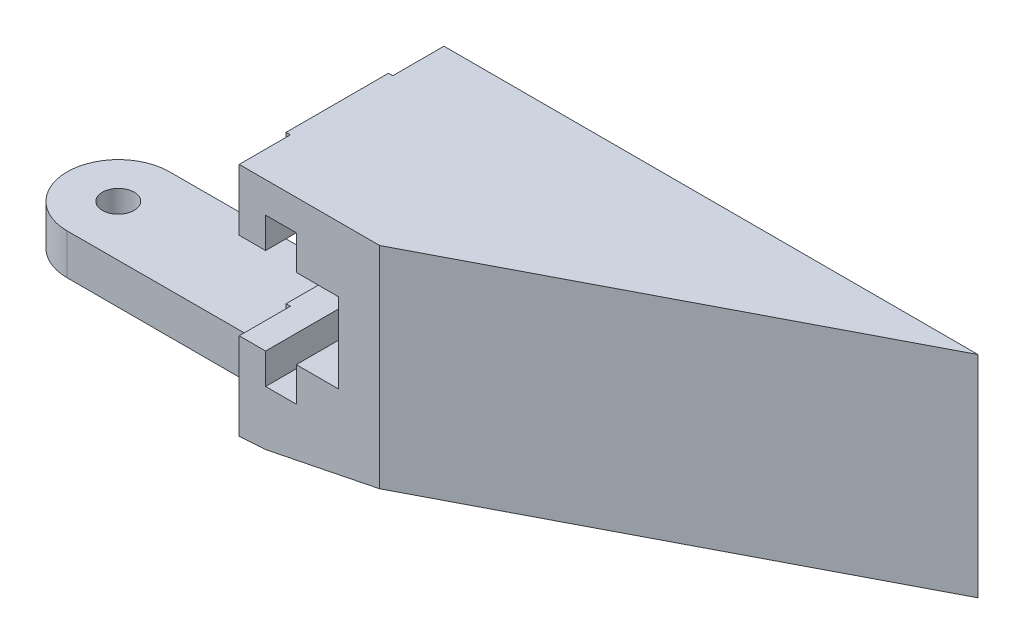
ISO-10303-21;
HEADER;
FILE_DESCRIPTION(('STEP AP214'),'2;1');
FILE_NAME('part.step','',(''),(''),'','','');
FILE_SCHEMA(('AUTOMOTIVE_DESIGN { 1 0 10303 214 1 1 1 1 }'));
ENDSEC;
DATA;
#1=APPLICATION_CONTEXT('core data for automotive mechanical design processes');
#2=APPLICATION_PROTOCOL_DEFINITION('international standard','automotive_design',2000,#1);
#3=PRODUCT_CONTEXT('',#1,'mechanical');
#4=PRODUCT('Part','Part','',(#3));
#5=PRODUCT_RELATED_PRODUCT_CATEGORY('part','',(#4));
#6=PRODUCT_DEFINITION_FORMATION('','',#4);
#7=PRODUCT_DEFINITION_CONTEXT('part definition',#1,'design');
#8=PRODUCT_DEFINITION('design','',#6,#7);
#9=PRODUCT_DEFINITION_SHAPE('','',#8);
#10=(LENGTH_UNIT() NAMED_UNIT(*) SI_UNIT(.MILLI.,.METRE.));
#11=(NAMED_UNIT(*) PLANE_ANGLE_UNIT() SI_UNIT($,.RADIAN.));
#12=(NAMED_UNIT(*) SI_UNIT($,.STERADIAN.) SOLID_ANGLE_UNIT());
#13=UNCERTAINTY_MEASURE_WITH_UNIT(LENGTH_MEASURE(1.E-05),#10,'distance_accuracy_value','');
#14=(GEOMETRIC_REPRESENTATION_CONTEXT(3) GLOBAL_UNCERTAINTY_ASSIGNED_CONTEXT((#13)) GLOBAL_UNIT_ASSIGNED_CONTEXT((#10,
#11,#12)) REPRESENTATION_CONTEXT('',''));
#15=CARTESIAN_POINT('',(0.,0.,0.));
#16=DIRECTION('',(0.,0.,1.));
#17=DIRECTION('',(1.,0.,0.));
#18=AXIS2_PLACEMENT_3D('',#15,#16,#17);
#19=CARTESIAN_POINT('',(-39.49001324769,-7.53608306718795,20.));
#20=DIRECTION('',(0.00136731456757834,-0.999999065225,0.));
#21=DIRECTION('',(0.999999065225,0.00136731456757834,0.));
#22=AXIS2_PLACEMENT_3D('',#19,#20,#21);
#23=PLANE('',#22);
#24=CARTESIAN_POINT('',(-34.49001324769,-7.5292464879594,9.99999999999999));
#25=DIRECTION('',(0.00136731456757834,-0.999999065225,0.));
#26=DIRECTION('',(-0.999999065225,-0.00136731456757834,0.));
#27=AXIS2_PLACEMENT_3D('',#24,#25,#26);
#28=ELLIPSE('',#27,1.55000144890261,1.55);
#29=CARTESIAN_POINT('',(-36.04001324769,-7.53136582752025,9.99999999999999));
#30=VERTEX_POINT('',#29);
#31=EDGE_CURVE('E234',#30,#30,#28,.T.);
#32=ORIENTED_EDGE('',*,*,#31,.T.);
#33=EDGE_LOOP('',(#32));
#34=FACE_BOUND('',#33,.T.);
#35=DIRECTION('',(-0.999999065225,-0.00136731456757834,0.));
#36=VECTOR('',#35,1.);
#37=CARTESIAN_POINT('',(-39.49001324769,-7.53608306718795,5.));
#38=LINE('',#37,#36);
#39=CARTESIAN_POINT('',(-13.1003043144092,-7.49999999999978,5.));
#40=VERTEX_POINT('',#39);
#41=CARTESIAN_POINT('',(-34.49001324769,-7.52924648795939,5.));
#42=VERTEX_POINT('',#41);
#43=EDGE_CURVE('E244',#40,#42,#38,.T.);
#44=ORIENTED_EDGE('',*,*,#43,.T.);
#45=CARTESIAN_POINT('',(-34.49001324769,-7.5292464879594,9.99999999999999));
#46=DIRECTION('',(0.00136731456757834,-0.999999065225,0.));
#47=DIRECTION('',(-0.999999065225,-0.00136731456757834,0.));
#48=AXIS2_PLACEMENT_3D('',#45,#46,#47);
#49=ELLIPSE('',#48,5.00000467387938,5.00000000000001);
#50=CARTESIAN_POINT('',(-34.49001324769,-7.52924648795939,15.));
#51=VERTEX_POINT('',#50);
#52=EDGE_CURVE('E224',#42,#51,#49,.F.);
#53=ORIENTED_EDGE('',*,*,#52,.T.);
#54=DIRECTION('',(0.999999065225,0.00136731456757834,0.));
#55=VECTOR('',#54,1.);
#56=CARTESIAN_POINT('',(-39.49001324769,-7.53608306718795,15.));
#57=LINE('',#56,#55);
#58=CARTESIAN_POINT('',(-13.1003043144092,-7.49999999999978,15.));
#59=VERTEX_POINT('',#58);
#60=EDGE_CURVE('E273',#51,#59,#57,.T.);
#61=ORIENTED_EDGE('',*,*,#60,.T.);
#62=DIRECTION('',(0.,0.,-1.));
#63=VECTOR('',#62,1.);
#64=CARTESIAN_POINT('',(-13.1003043144092,-7.49999999999978,20.));
#65=LINE('',#64,#63);
#66=EDGE_CURVE('E426',#59,#40,#65,.T.);
#67=ORIENTED_EDGE('',*,*,#66,.T.);
#68=EDGE_LOOP('',(#44,#53,#61,#67));
#69=FACE_BOUND('',#68,.T.);
#70=ADVANCED_FACE('F39',(#34,#69),#23,.F.);
#71=CARTESIAN_POINT('',(-12.6786659876891,-11.5000000000002,20.));
#72=DIRECTION('',(0.,1.,0.));
#73=DIRECTION('',(0.,0.,1.));
#74=AXIS2_PLACEMENT_3D('',#71,#72,#73);
#75=PLANE('',#74);
#76=CARTESIAN_POINT('',(-34.49001324769,-11.5000000000002,9.99999999999999));
#77=DIRECTION('',(0.,1.,0.));
#78=DIRECTION('',(0.,0.,1.));
#79=AXIS2_PLACEMENT_3D('',#76,#77,#78);
#80=CIRCLE('',#79,1.55);
#81=CARTESIAN_POINT('',(-34.49001324769,-11.5000000000002,11.55));
#82=VERTEX_POINT('',#81);
#83=EDGE_CURVE('E43',#82,#82,#80,.T.);
#84=ORIENTED_EDGE('',*,*,#83,.T.);
#85=EDGE_LOOP('',(#84));
#86=FACE_BOUND('',#85,.T.);
#87=CARTESIAN_POINT('',(-34.49001324769,-11.5000000000002,9.99999999999999));
#88=DIRECTION('',(0.,-1.,0.));
#89=DIRECTION('',(0.,0.,-1.));
#90=AXIS2_PLACEMENT_3D('',#87,#88,#89);
#91=CIRCLE('',#90,5.00000000000001);
#92=CARTESIAN_POINT('',(-34.49001324769,-11.5000000000002,5.));
#93=VERTEX_POINT('',#92);
#94=CARTESIAN_POINT('',(-34.49001324769,-11.5000000000002,15.));
#95=VERTEX_POINT('',#94);
#96=EDGE_CURVE('E58',#93,#95,#91,.F.);
#97=ORIENTED_EDGE('',*,*,#96,.F.);
#98=DIRECTION('',(1.,0.,0.));
#99=VECTOR('',#98,1.);
#100=CARTESIAN_POINT('',(-12.6786659876891,-11.5000000000002,5.));
#101=LINE('',#100,#99);
#102=CARTESIAN_POINT('',(-12.6786659876891,-11.5000000000002,5.));
#103=VERTEX_POINT('',#102);
#104=EDGE_CURVE('E230',#93,#103,#101,.T.);
#105=ORIENTED_EDGE('',*,*,#104,.T.);
#106=DIRECTION('',(0.,0.,-1.));
#107=VECTOR('',#106,1.);
#108=CARTESIAN_POINT('',(-12.6786659876891,-11.5000000000002,20.));
#109=LINE('',#108,#107);
#110=CARTESIAN_POINT('',(-12.6786659876891,-11.5000000000002,15.));
#111=VERTEX_POINT('',#110);
#112=EDGE_CURVE('E421',#111,#103,#109,.T.);
#113=ORIENTED_EDGE('',*,*,#112,.F.);
#114=DIRECTION('',(-1.,0.,0.));
#115=VECTOR('',#114,1.);
#116=CARTESIAN_POINT('',(-12.6786659876891,-11.5000000000002,15.));
#117=LINE('',#116,#115);
#118=EDGE_CURVE('E232',#111,#95,#117,.T.);
#119=ORIENTED_EDGE('',*,*,#118,.T.);
#120=EDGE_LOOP('',(#97,#105,#113,#119));
#121=FACE_BOUND('',#120,.T.);
#122=ADVANCED_FACE('F227',(#86,#121),#75,.F.);
#123=CARTESIAN_POINT('',(-12.6786659876891,11.5000000000002,15.));
#124=DIRECTION('',(0.,0.,-1.));
#125=DIRECTION('',(-1.,0.,0.));
#126=AXIS2_PLACEMENT_3D('',#123,#124,#125);
#127=PLANE('',#126);
#128=DIRECTION('',(0.,-1.,0.));
#129=VECTOR('',#128,1.);
#130=CARTESIAN_POINT('',(-34.49001324769,11.5000000000002,15.));
#131=LINE('',#130,#129);
#132=EDGE_CURVE('E50',#95,#51,#131,.F.);
#133=ORIENTED_EDGE('',*,*,#132,.F.);
#134=ORIENTED_EDGE('',*,*,#118,.F.);
#135=DIRECTION('',(0.,-1.,0.));
#136=VECTOR('',#135,1.);
#137=CARTESIAN_POINT('',(-12.6786659876891,11.5000000000002,15.));
#138=LINE('',#137,#136);
#139=CARTESIAN_POINT('',(-12.6786659876891,-2.99999999999976,15.));
#140=VERTEX_POINT('',#139);
#141=EDGE_CURVE('E545',#140,#111,#138,.T.);
#142=ORIENTED_EDGE('',*,*,#141,.F.);
#143=DIRECTION('',(1.,0.,0.));
#144=VECTOR('',#143,1.);
#145=CARTESIAN_POINT('',(-13.1003043144092,-2.99999999999977,15.));
#146=LINE('',#145,#144);
#147=CARTESIAN_POINT('',(-13.1003043144092,-2.99999999999977,15.));
#148=VERTEX_POINT('',#147);
#149=EDGE_CURVE('E280',#148,#140,#146,.T.);
#150=ORIENTED_EDGE('',*,*,#149,.F.);
#151=DIRECTION('',(0.,1.,0.));
#152=VECTOR('',#151,1.);
#153=CARTESIAN_POINT('',(-13.1003043144092,-7.49999999999978,15.));
#154=LINE('',#153,#152);
#155=EDGE_CURVE('E276',#59,#148,#154,.T.);
#156=ORIENTED_EDGE('',*,*,#155,.F.);
#157=ORIENTED_EDGE('',*,*,#60,.F.);
#158=EDGE_LOOP('',(#133,#134,#142,#150,#156,#157));
#159=FACE_BOUND('',#158,.T.);
#160=ADVANCED_FACE('F493',(#159),#127,.F.);
#161=CARTESIAN_POINT('',(-13.1003043144223,5.50000000000023,20.));
#162=DIRECTION('',(1.,0.,0.));
#163=DIRECTION('',(0.,0.,-1.));
#164=AXIS2_PLACEMENT_3D('',#161,#162,#163);
#165=PLANE('',#164);
#166=DIRECTION('',(0.,0.,-1.));
#167=VECTOR('',#166,1.);
#168=CARTESIAN_POINT('',(-13.1003043144223,5.50000000000023,20.));
#169=LINE('',#168,#167);
#170=CARTESIAN_POINT('',(-13.1003043144223,5.50000000000023,15.));
#171=VERTEX_POINT('',#170);
#172=CARTESIAN_POINT('',(-13.1003043144223,5.50000000000023,5.));
#173=VERTEX_POINT('',#172);
#174=EDGE_CURVE('E474',#171,#173,#169,.T.);
#175=ORIENTED_EDGE('',*,*,#174,.F.);
#176=DIRECTION('',(0.,1.,0.));
#177=VECTOR('',#176,1.);
#178=CARTESIAN_POINT('',(-13.1003043144223,5.50000000000023,15.));
#179=LINE('',#178,#177);
#180=CARTESIAN_POINT('',(-13.1003043144223,11.5000000000002,15.));
#181=VERTEX_POINT('',#180);
#182=EDGE_CURVE('E288',#171,#181,#179,.T.);
#183=ORIENTED_EDGE('',*,*,#182,.T.);
#184=DIRECTION('',(0.,0.,-1.));
#185=VECTOR('',#184,1.);
#186=CARTESIAN_POINT('',(-13.1003043144223,11.5000000000002,20.));
#187=LINE('',#186,#185);
#188=CARTESIAN_POINT('',(-13.1003043144223,11.5000000000002,5.));
#189=VERTEX_POINT('',#188);
#190=EDGE_CURVE('E353',#181,#189,#187,.T.);
#191=ORIENTED_EDGE('',*,*,#190,.T.);
#192=DIRECTION('',(0.,-1.,0.));
#193=VECTOR('',#192,1.);
#194=CARTESIAN_POINT('',(-13.1003043144223,5.50000000000023,5.));
#195=LINE('',#194,#193);
#196=EDGE_CURVE('E267',#189,#173,#195,.T.);
#197=ORIENTED_EDGE('',*,*,#196,.T.);
#198=EDGE_LOOP('',(#175,#183,#191,#197));
#199=FACE_BOUND('',#198,.T.);
#200=ADVANCED_FACE('F41',(#199),#165,.F.);
#201=CARTESIAN_POINT('',(-10.1003043144092,5.50000000000023,20.));
#202=DIRECTION('',(0.,1.,0.));
#203=DIRECTION('',(0.,0.,1.));
#204=AXIS2_PLACEMENT_3D('',#201,#202,#203);
#205=PLANE('',#204);
#206=DIRECTION('',(1.,0.,0.));
#207=VECTOR('',#206,1.);
#208=CARTESIAN_POINT('',(-10.1003043144092,5.50000000000023,20.));
#209=LINE('',#208,#207);
#210=CARTESIAN_POINT('',(-12.6786659876891,5.50000000000023,20.));
#211=VERTEX_POINT('',#210);
#212=CARTESIAN_POINT('',(-10.1003043144092,5.50000000000023,20.));
#213=VERTEX_POINT('',#212);
#214=EDGE_CURVE('E304',#211,#213,#209,.T.);
#215=ORIENTED_EDGE('',*,*,#214,.F.);
#216=DIRECTION('',(0.,0.,-1.));
#217=VECTOR('',#216,1.);
#218=CARTESIAN_POINT('',(-12.6786659876891,5.50000000000023,20.));
#219=LINE('',#218,#217);
#220=CARTESIAN_POINT('',(-12.6786659876891,5.50000000000023,15.));
#221=VERTEX_POINT('',#220);
#222=EDGE_CURVE('E245',#211,#221,#219,.T.);
#223=ORIENTED_EDGE('',*,*,#222,.T.);
#224=DIRECTION('',(-1.,0.,0.));
#225=VECTOR('',#224,1.);
#226=CARTESIAN_POINT('',(-10.1003043144092,5.50000000000023,15.));
#227=LINE('',#226,#225);
#228=EDGE_CURVE('E284',#221,#171,#227,.T.);
#229=ORIENTED_EDGE('',*,*,#228,.T.);
#230=ORIENTED_EDGE('',*,*,#174,.T.);
#231=DIRECTION('',(1.,0.,0.));
#232=VECTOR('',#231,1.);
#233=CARTESIAN_POINT('',(-10.1003043144092,5.50000000000023,5.));
#234=LINE('',#233,#232);
#235=CARTESIAN_POINT('',(-12.6786659876891,5.50000000000023,5.));
#236=VERTEX_POINT('',#235);
#237=EDGE_CURVE('E263',#173,#236,#234,.T.);
#238=ORIENTED_EDGE('',*,*,#237,.T.);
#239=DIRECTION('',(0.,0.,-1.));
#240=VECTOR('',#239,1.);
#241=CARTESIAN_POINT('',(-12.6786659876891,5.50000000000023,20.));
#242=LINE('',#241,#240);
#243=CARTESIAN_POINT('',(-12.6786659876891,5.50000000000023,0.));
#244=VERTEX_POINT('',#243);
#245=EDGE_CURVE('E507',#236,#244,#242,.T.);
#246=ORIENTED_EDGE('',*,*,#245,.T.);
#247=DIRECTION('',(1.,0.,0.));
#248=VECTOR('',#247,1.);
#249=CARTESIAN_POINT('',(-10.1003043144092,5.50000000000023,0.));
#250=LINE('',#249,#248);
#251=CARTESIAN_POINT('',(-10.1003043144092,5.50000000000023,0.));
#252=VERTEX_POINT('',#251);
#253=EDGE_CURVE('E303',#244,#252,#250,.T.);
#254=ORIENTED_EDGE('',*,*,#253,.T.);
#255=DIRECTION('',(0.,0.,-1.));
#256=VECTOR('',#255,1.);
#257=CARTESIAN_POINT('',(-10.1003043144092,5.50000000000023,20.));
#258=LINE('',#257,#256);
#259=EDGE_CURVE('E470',#213,#252,#258,.T.);
#260=ORIENTED_EDGE('',*,*,#259,.F.);
#261=EDGE_LOOP('',(#215,#223,#229,#230,#238,#246,#254,#260));
#262=FACE_BOUND('',#261,.T.);
#263=ADVANCED_FACE('F631',(#262),#205,.F.);
#264=CARTESIAN_POINT('',(-10.1003043144092,8.50000000000023,20.));
#265=DIRECTION('',(-1.,0.,0.));
#266=DIRECTION('',(0.,0.,1.));
#267=AXIS2_PLACEMENT_3D('',#264,#265,#266);
#268=PLANE('',#267);
#269=DIRECTION('',(0.,1.,0.));
#270=VECTOR('',#269,1.);
#271=CARTESIAN_POINT('',(-10.1003043144092,8.50000000000023,0.));
#272=LINE('',#271,#270);
#273=CARTESIAN_POINT('',(-10.1003043144092,8.50000000000023,0.));
#274=VERTEX_POINT('',#273);
#275=EDGE_CURVE('E356',#252,#274,#272,.T.);
#276=ORIENTED_EDGE('',*,*,#275,.T.);
#277=DIRECTION('',(0.,0.,-1.));
#278=VECTOR('',#277,1.);
#279=CARTESIAN_POINT('',(-10.1003043144092,8.50000000000023,20.));
#280=LINE('',#279,#278);
#281=CARTESIAN_POINT('',(-10.1003043144092,8.50000000000023,20.));
#282=VERTEX_POINT('',#281);
#283=EDGE_CURVE('E466',#282,#274,#280,.T.);
#284=ORIENTED_EDGE('',*,*,#283,.F.);
#285=DIRECTION('',(0.,1.,0.));
#286=VECTOR('',#285,1.);
#287=CARTESIAN_POINT('',(-10.1003043144092,8.50000000000023,20.));
#288=LINE('',#287,#286);
#289=EDGE_CURVE('E307',#213,#282,#288,.T.);
#290=ORIENTED_EDGE('',*,*,#289,.F.);
#291=ORIENTED_EDGE('',*,*,#259,.T.);
#292=EDGE_LOOP('',(#276,#284,#290,#291));
#293=FACE_BOUND('',#292,.T.);
#294=ADVANCED_FACE('F628',(#293),#268,.F.);
#295=CARTESIAN_POINT('',(-7.10030431440922,8.50000000000023,20.));
#296=DIRECTION('',(0.,1.,0.));
#297=DIRECTION('',(0.,0.,1.));
#298=AXIS2_PLACEMENT_3D('',#295,#296,#297);
#299=PLANE('',#298);
#300=DIRECTION('',(1.,0.,0.));
#301=VECTOR('',#300,1.);
#302=CARTESIAN_POINT('',(-7.10030431440922,8.50000000000023,0.));
#303=LINE('',#302,#301);
#304=CARTESIAN_POINT('',(-7.10030431440922,8.50000000000023,0.));
#305=VERTEX_POINT('',#304);
#306=EDGE_CURVE('E359',#274,#305,#303,.T.);
#307=ORIENTED_EDGE('',*,*,#306,.T.);
#308=DIRECTION('',(0.,0.,-1.));
#309=VECTOR('',#308,1.);
#310=CARTESIAN_POINT('',(-7.10030431440922,8.50000000000023,20.));
#311=LINE('',#310,#309);
#312=CARTESIAN_POINT('',(-7.10030431440922,8.50000000000023,20.));
#313=VERTEX_POINT('',#312);
#314=EDGE_CURVE('E462',#313,#305,#311,.T.);
#315=ORIENTED_EDGE('',*,*,#314,.F.);
#316=DIRECTION('',(1.,0.,0.));
#317=VECTOR('',#316,1.);
#318=CARTESIAN_POINT('',(-7.10030431440922,8.50000000000023,20.));
#319=LINE('',#318,#317);
#320=EDGE_CURVE('E311',#282,#313,#319,.T.);
#321=ORIENTED_EDGE('',*,*,#320,.F.);
#322=ORIENTED_EDGE('',*,*,#283,.T.);
#323=EDGE_LOOP('',(#307,#315,#321,#322));
#324=FACE_BOUND('',#323,.T.);
#325=ADVANCED_FACE('F624',(#324),#299,.F.);
#326=CARTESIAN_POINT('',(-7.10030431440922,5.15000000000023,20.));
#327=DIRECTION('',(1.,0.,0.));
#328=DIRECTION('',(0.,0.,-1.));
#329=AXIS2_PLACEMENT_3D('',#326,#327,#328);
#330=PLANE('',#329);
#331=DIRECTION('',(0.,-1.,0.));
#332=VECTOR('',#331,1.);
#333=CARTESIAN_POINT('',(-7.10030431440922,5.15000000000023,0.));
#334=LINE('',#333,#332);
#335=CARTESIAN_POINT('',(-7.10030431440922,5.15000000000023,0.));
#336=VERTEX_POINT('',#335);
#337=EDGE_CURVE('E362',#305,#336,#334,.T.);
#338=ORIENTED_EDGE('',*,*,#337,.T.);
#339=DIRECTION('',(0.,0.,-1.));
#340=VECTOR('',#339,1.);
#341=CARTESIAN_POINT('',(-7.10030431440922,5.15000000000023,20.));
#342=LINE('',#341,#340);
#343=CARTESIAN_POINT('',(-7.10030431440922,5.15000000000023,20.));
#344=VERTEX_POINT('',#343);
#345=EDGE_CURVE('E458',#344,#336,#342,.T.);
#346=ORIENTED_EDGE('',*,*,#345,.F.);
#347=DIRECTION('',(0.,-1.,0.));
#348=VECTOR('',#347,1.);
#349=CARTESIAN_POINT('',(-7.10030431440922,5.15000000000023,20.));
#350=LINE('',#349,#348);
#351=EDGE_CURVE('E314',#313,#344,#350,.T.);
#352=ORIENTED_EDGE('',*,*,#351,.F.);
#353=ORIENTED_EDGE('',*,*,#314,.T.);
#354=EDGE_LOOP('',(#338,#346,#352,#353));
#355=FACE_BOUND('',#354,.T.);
#356=ADVANCED_FACE('F620',(#355),#330,.F.);
#357=CARTESIAN_POINT('',(-3.00030431440922,5.15000000000023,20.));
#358=DIRECTION('',(0.,1.,0.));
#359=DIRECTION('',(0.,0.,1.));
#360=AXIS2_PLACEMENT_3D('',#357,#358,#359);
#361=PLANE('',#360);
#362=DIRECTION('',(1.,0.,0.));
#363=VECTOR('',#362,1.);
#364=CARTESIAN_POINT('',(-3.00030431440922,5.15000000000023,0.));
#365=LINE('',#364,#363);
#366=CARTESIAN_POINT('',(-3.00030431440922,5.15000000000023,0.));
#367=VERTEX_POINT('',#366);
#368=EDGE_CURVE('E365',#336,#367,#365,.T.);
#369=ORIENTED_EDGE('',*,*,#368,.T.);
#370=DIRECTION('',(0.,0.,-1.));
#371=VECTOR('',#370,1.);
#372=CARTESIAN_POINT('',(-3.00030431440922,5.15000000000023,20.));
#373=LINE('',#372,#371);
#374=CARTESIAN_POINT('',(-3.00030431440922,5.15000000000023,20.));
#375=VERTEX_POINT('',#374);
#376=EDGE_CURVE('E454',#375,#367,#373,.T.);
#377=ORIENTED_EDGE('',*,*,#376,.F.);
#378=DIRECTION('',(1.,0.,0.));
#379=VECTOR('',#378,1.);
#380=CARTESIAN_POINT('',(-3.00030431440922,5.15000000000023,20.));
#381=LINE('',#380,#379);
#382=EDGE_CURVE('E317',#344,#375,#381,.T.);
#383=ORIENTED_EDGE('',*,*,#382,.F.);
#384=ORIENTED_EDGE('',*,*,#345,.T.);
#385=EDGE_LOOP('',(#369,#377,#383,#384));
#386=FACE_BOUND('',#385,.T.);
#387=ADVANCED_FACE('F616',(#386),#361,.F.);
#388=CARTESIAN_POINT('',(-3.00030431440922,-2.64999999999977,20.));
#389=DIRECTION('',(1.,0.,0.));
#390=DIRECTION('',(0.,0.,-1.));
#391=AXIS2_PLACEMENT_3D('',#388,#389,#390);
#392=PLANE('',#391);
#393=DIRECTION('',(0.,-1.,0.));
#394=VECTOR('',#393,1.);
#395=CARTESIAN_POINT('',(-3.00030431440922,-2.64999999999977,0.));
#396=LINE('',#395,#394);
#397=CARTESIAN_POINT('',(-3.00030431440922,-2.64999999999977,0.));
#398=VERTEX_POINT('',#397);
#399=EDGE_CURVE('E368',#367,#398,#396,.T.);
#400=ORIENTED_EDGE('',*,*,#399,.T.);
#401=DIRECTION('',(0.,0.,-1.));
#402=VECTOR('',#401,1.);
#403=CARTESIAN_POINT('',(-3.00030431440922,-2.64999999999977,20.));
#404=LINE('',#403,#402);
#405=CARTESIAN_POINT('',(-3.00030431440922,-2.64999999999977,20.));
#406=VERTEX_POINT('',#405);
#407=EDGE_CURVE('E450',#406,#398,#404,.T.);
#408=ORIENTED_EDGE('',*,*,#407,.F.);
#409=DIRECTION('',(0.,-1.,0.));
#410=VECTOR('',#409,1.);
#411=CARTESIAN_POINT('',(-3.00030431440922,-2.64999999999977,20.));
#412=LINE('',#411,#410);
#413=EDGE_CURVE('E320',#375,#406,#412,.T.);
#414=ORIENTED_EDGE('',*,*,#413,.F.);
#415=ORIENTED_EDGE('',*,*,#376,.T.);
#416=EDGE_LOOP('',(#400,#408,#414,#415));
#417=FACE_BOUND('',#416,.T.);
#418=ADVANCED_FACE('F612',(#417),#392,.F.);
#419=CARTESIAN_POINT('',(-7.10030431440923,-2.64999999999977,20.));
#420=DIRECTION('',(0.,-1.,0.));
#421=DIRECTION('',(0.,0.,-1.));
#422=AXIS2_PLACEMENT_3D('',#419,#420,#421);
#423=PLANE('',#422);
#424=DIRECTION('',(-1.,0.,0.));
#425=VECTOR('',#424,1.);
#426=CARTESIAN_POINT('',(-7.10030431440923,-2.64999999999977,0.));
#427=LINE('',#426,#425);
#428=CARTESIAN_POINT('',(-7.10030431440923,-2.64999999999977,0.));
#429=VERTEX_POINT('',#428);
#430=EDGE_CURVE('E371',#398,#429,#427,.T.);
#431=ORIENTED_EDGE('',*,*,#430,.T.);
#432=DIRECTION('',(0.,0.,-1.));
#433=VECTOR('',#432,1.);
#434=CARTESIAN_POINT('',(-7.10030431440923,-2.64999999999977,20.));
#435=LINE('',#434,#433);
#436=CARTESIAN_POINT('',(-7.10030431440923,-2.64999999999977,20.));
#437=VERTEX_POINT('',#436);
#438=EDGE_CURVE('E446',#437,#429,#435,.T.);
#439=ORIENTED_EDGE('',*,*,#438,.F.);
#440=DIRECTION('',(-1.,0.,0.));
#441=VECTOR('',#440,1.);
#442=CARTESIAN_POINT('',(-7.10030431440923,-2.64999999999977,20.));
#443=LINE('',#442,#441);
#444=EDGE_CURVE('E323',#406,#437,#443,.T.);
#445=ORIENTED_EDGE('',*,*,#444,.F.);
#446=ORIENTED_EDGE('',*,*,#407,.T.);
#447=EDGE_LOOP('',(#431,#439,#445,#446));
#448=FACE_BOUND('',#447,.T.);
#449=ADVANCED_FACE('F608',(#448),#423,.F.);
#450=CARTESIAN_POINT('',(-7.10030431440923,-5.99999999999977,20.));
#451=DIRECTION('',(1.,0.,0.));
#452=DIRECTION('',(0.,0.,-1.));
#453=AXIS2_PLACEMENT_3D('',#450,#451,#452);
#454=PLANE('',#453);
#455=DIRECTION('',(0.,-1.,0.));
#456=VECTOR('',#455,1.);
#457=CARTESIAN_POINT('',(-7.10030431440923,-5.99999999999977,0.));
#458=LINE('',#457,#456);
#459=CARTESIAN_POINT('',(-7.10030431440923,-5.99999999999977,0.));
#460=VERTEX_POINT('',#459);
#461=EDGE_CURVE('E374',#429,#460,#458,.T.);
#462=ORIENTED_EDGE('',*,*,#461,.T.);
#463=DIRECTION('',(0.,0.,-1.));
#464=VECTOR('',#463,1.);
#465=CARTESIAN_POINT('',(-7.10030431440923,-5.99999999999977,20.));
#466=LINE('',#465,#464);
#467=CARTESIAN_POINT('',(-7.10030431440923,-5.99999999999977,20.));
#468=VERTEX_POINT('',#467);
#469=EDGE_CURVE('E442',#468,#460,#466,.T.);
#470=ORIENTED_EDGE('',*,*,#469,.F.);
#471=DIRECTION('',(0.,-1.,0.));
#472=VECTOR('',#471,1.);
#473=CARTESIAN_POINT('',(-7.10030431440923,-5.99999999999977,20.));
#474=LINE('',#473,#472);
#475=EDGE_CURVE('E326',#437,#468,#474,.T.);
#476=ORIENTED_EDGE('',*,*,#475,.F.);
#477=ORIENTED_EDGE('',*,*,#438,.T.);
#478=EDGE_LOOP('',(#462,#470,#476,#477));
#479=FACE_BOUND('',#478,.T.);
#480=ADVANCED_FACE('F604',(#479),#454,.F.);
#481=CARTESIAN_POINT('',(-10.1003043144092,-5.99999999999977,20.));
#482=DIRECTION('',(0.,-1.,0.));
#483=DIRECTION('',(0.,0.,-1.));
#484=AXIS2_PLACEMENT_3D('',#481,#482,#483);
#485=PLANE('',#484);
#486=DIRECTION('',(-1.,0.,0.));
#487=VECTOR('',#486,1.);
#488=CARTESIAN_POINT('',(-10.1003043144092,-5.99999999999977,0.));
#489=LINE('',#488,#487);
#490=CARTESIAN_POINT('',(-10.1003043144092,-5.99999999999977,0.));
#491=VERTEX_POINT('',#490);
#492=EDGE_CURVE('E377',#460,#491,#489,.T.);
#493=ORIENTED_EDGE('',*,*,#492,.T.);
#494=DIRECTION('',(0.,0.,-1.));
#495=VECTOR('',#494,1.);
#496=CARTESIAN_POINT('',(-10.1003043144092,-5.99999999999977,20.));
#497=LINE('',#496,#495);
#498=CARTESIAN_POINT('',(-10.1003043144092,-5.99999999999977,20.));
#499=VERTEX_POINT('',#498);
#500=EDGE_CURVE('E438',#499,#491,#497,.T.);
#501=ORIENTED_EDGE('',*,*,#500,.F.);
#502=DIRECTION('',(-1.,0.,0.));
#503=VECTOR('',#502,1.);
#504=CARTESIAN_POINT('',(-10.1003043144092,-5.99999999999977,20.));
#505=LINE('',#504,#503);
#506=EDGE_CURVE('E329',#468,#499,#505,.T.);
#507=ORIENTED_EDGE('',*,*,#506,.F.);
#508=ORIENTED_EDGE('',*,*,#469,.T.);
#509=EDGE_LOOP('',(#493,#501,#507,#508));
#510=FACE_BOUND('',#509,.T.);
#511=ADVANCED_FACE('F601',(#510),#485,.F.);
#512=CARTESIAN_POINT('',(-10.1003043144092,-2.99999999999977,20.));
#513=DIRECTION('',(-1.,0.,0.));
#514=DIRECTION('',(0.,0.,1.));
#515=AXIS2_PLACEMENT_3D('',#512,#513,#514);
#516=PLANE('',#515);
#517=DIRECTION('',(0.,1.,0.));
#518=VECTOR('',#517,1.);
#519=CARTESIAN_POINT('',(-10.1003043144092,-2.99999999999977,0.));
#520=LINE('',#519,#518);
#521=CARTESIAN_POINT('',(-10.1003043144092,-2.99999999999977,0.));
#522=VERTEX_POINT('',#521);
#523=EDGE_CURVE('E380',#491,#522,#520,.T.);
#524=ORIENTED_EDGE('',*,*,#523,.T.);
#525=DIRECTION('',(0.,0.,-1.));
#526=VECTOR('',#525,1.);
#527=CARTESIAN_POINT('',(-10.1003043144092,-2.99999999999977,20.));
#528=LINE('',#527,#526);
#529=CARTESIAN_POINT('',(-10.1003043144092,-2.99999999999977,20.));
#530=VERTEX_POINT('',#529);
#531=EDGE_CURVE('E434',#530,#522,#528,.T.);
#532=ORIENTED_EDGE('',*,*,#531,.F.);
#533=DIRECTION('',(0.,1.,0.));
#534=VECTOR('',#533,1.);
#535=CARTESIAN_POINT('',(-10.1003043144092,-2.99999999999977,20.));
#536=LINE('',#535,#534);
#537=EDGE_CURVE('E332',#499,#530,#536,.T.);
#538=ORIENTED_EDGE('',*,*,#537,.F.);
#539=ORIENTED_EDGE('',*,*,#500,.T.);
#540=EDGE_LOOP('',(#524,#532,#538,#539));
#541=FACE_BOUND('',#540,.T.);
#542=ADVANCED_FACE('F531',(#541),#516,.F.);
#543=CARTESIAN_POINT('',(-13.1003043144092,-2.99999999999977,20.));
#544=DIRECTION('',(0.,-1.,0.));
#545=DIRECTION('',(0.,0.,-1.));
#546=AXIS2_PLACEMENT_3D('',#543,#544,#545);
#547=PLANE('',#546);
#548=ORIENTED_EDGE('',*,*,#149,.T.);
#549=DIRECTION('',(0.,0.,1.));
#550=VECTOR('',#549,1.);
#551=CARTESIAN_POINT('',(-12.6786659876891,-2.99999999999977,20.));
#552=LINE('',#551,#550);
#553=CARTESIAN_POINT('',(-12.6786659876891,-2.99999999999976,20.));
#554=VERTEX_POINT('',#553);
#555=EDGE_CURVE('E252',#140,#554,#552,.T.);
#556=ORIENTED_EDGE('',*,*,#555,.T.);
#557=DIRECTION('',(-1.,0.,0.));
#558=VECTOR('',#557,1.);
#559=CARTESIAN_POINT('',(-13.1003043144092,-2.99999999999977,20.));
#560=LINE('',#559,#558);
#561=EDGE_CURVE('E335',#530,#554,#560,.T.);
#562=ORIENTED_EDGE('',*,*,#561,.F.);
#563=ORIENTED_EDGE('',*,*,#531,.T.);
#564=DIRECTION('',(-1.,0.,0.));
#565=VECTOR('',#564,1.);
#566=CARTESIAN_POINT('',(-13.1003043144092,-2.99999999999977,0.));
#567=LINE('',#566,#565);
#568=CARTESIAN_POINT('',(-12.6786659876891,-2.99999999999977,0.));
#569=VERTEX_POINT('',#568);
#570=EDGE_CURVE('E383',#522,#569,#567,.T.);
#571=ORIENTED_EDGE('',*,*,#570,.T.);
#572=DIRECTION('',(0.,0.,1.));
#573=VECTOR('',#572,1.);
#574=CARTESIAN_POINT('',(-12.6786659876891,-2.99999999999977,20.));
#575=LINE('',#574,#573);
#576=CARTESIAN_POINT('',(-12.6786659876891,-2.99999999999976,5.));
#577=VERTEX_POINT('',#576);
#578=EDGE_CURVE('E502',#569,#577,#575,.T.);
#579=ORIENTED_EDGE('',*,*,#578,.T.);
#580=DIRECTION('',(-1.,0.,0.));
#581=VECTOR('',#580,1.);
#582=CARTESIAN_POINT('',(-13.1003043144092,-2.99999999999977,5.));
#583=LINE('',#582,#581);
#584=CARTESIAN_POINT('',(-13.1003043144092,-2.99999999999977,5.));
#585=VERTEX_POINT('',#584);
#586=EDGE_CURVE('E259',#577,#585,#583,.T.);
#587=ORIENTED_EDGE('',*,*,#586,.T.);
#588=DIRECTION('',(0.,0.,-1.));
#589=VECTOR('',#588,1.);
#590=CARTESIAN_POINT('',(-13.1003043144092,-2.99999999999977,20.));
#591=LINE('',#590,#589);
#592=EDGE_CURVE('E430',#148,#585,#591,.T.);
#593=ORIENTED_EDGE('',*,*,#592,.F.);
#594=EDGE_LOOP('',(#548,#556,#562,#563,#571,#579,#587,#593));
#595=FACE_BOUND('',#594,.T.);
#596=ADVANCED_FACE('F501',(#595),#547,.F.);
#597=CARTESIAN_POINT('',(-13.1003043144092,-7.49999999999978,20.));
#598=DIRECTION('',(1.,0.,0.));
#599=DIRECTION('',(0.,0.,-1.));
#600=AXIS2_PLACEMENT_3D('',#597,#598,#599);
#601=PLANE('',#600);
#602=ORIENTED_EDGE('',*,*,#66,.F.);
#603=ORIENTED_EDGE('',*,*,#155,.T.);
#604=ORIENTED_EDGE('',*,*,#592,.T.);
#605=DIRECTION('',(0.,-1.,0.));
#606=VECTOR('',#605,1.);
#607=CARTESIAN_POINT('',(-13.1003043144092,-7.49999999999978,5.));
#608=LINE('',#607,#606);
#609=EDGE_CURVE('E249',#585,#40,#608,.T.);
#610=ORIENTED_EDGE('',*,*,#609,.T.);
#611=EDGE_LOOP('',(#602,#603,#604,#610));
#612=FACE_BOUND('',#611,.T.);
#613=ADVANCED_FACE('F498',(#612),#601,.F.);
#614=CARTESIAN_POINT('',(-10.0240029671808,-11.3230362015424,20.));
#615=DIRECTION('',(-0.066513870443531,0.997785500515327,0.));
#616=DIRECTION('',(-0.997785500515327,-0.066513870443531,0.));
#617=AXIS2_PLACEMENT_3D('',#614,#615,#616);
#618=PLANE('',#617);
#619=DIRECTION('',(0.997785500515327,0.066513870443531,0.));
#620=VECTOR('',#619,1.);
#621=CARTESIAN_POINT('',(-10.0240029671808,-11.3230362015424,0.));
#622=LINE('',#621,#620);
#623=CARTESIAN_POINT('',(-12.6786659876891,-11.5000000000002,0.));
#624=VERTEX_POINT('',#623);
#625=CARTESIAN_POINT('',(-10.0240029671808,-11.3230362015424,0.));
#626=VERTEX_POINT('',#625);
#627=EDGE_CURVE('E387',#624,#626,#622,.T.);
#628=ORIENTED_EDGE('',*,*,#627,.T.);
#629=DIRECTION('',(0.,0.,-1.));
#630=VECTOR('',#629,1.);
#631=CARTESIAN_POINT('',(-10.0240029671808,-11.3230362015424,20.));
#632=LINE('',#631,#630);
#633=CARTESIAN_POINT('',(-10.0240029671808,-11.3230362015424,20.));
#634=VERTEX_POINT('',#633);
#635=EDGE_CURVE('E417',#634,#626,#632,.T.);
#636=ORIENTED_EDGE('',*,*,#635,.F.);
#637=DIRECTION('',(0.997785500515327,0.066513870443531,0.));
#638=VECTOR('',#637,1.);
#639=CARTESIAN_POINT('',(-10.0240029671808,-11.3230362015424,20.));
#640=LINE('',#639,#638);
#641=CARTESIAN_POINT('',(-12.6786659876891,-11.5000000000002,20.));
#642=VERTEX_POINT('',#641);
#643=EDGE_CURVE('E339',#642,#634,#640,.T.);
#644=ORIENTED_EDGE('',*,*,#643,.F.);
#645=EDGE_CURVE('E422',#642,#111,#109,.T.);
#646=ORIENTED_EDGE('',*,*,#645,.T.);
#647=ORIENTED_EDGE('',*,*,#112,.T.);
#648=DIRECTION('',(0.,0.,-1.));
#649=VECTOR('',#648,1.);
#650=CARTESIAN_POINT('',(-12.6786659876891,-11.5000000000002,20.));
#651=LINE('',#650,#649);
#652=EDGE_CURVE('E508',#103,#624,#651,.T.);
#653=ORIENTED_EDGE('',*,*,#652,.T.);
#654=EDGE_LOOP('',(#628,#636,#644,#646,#647,#653));
#655=FACE_BOUND('',#654,.T.);
#656=ADVANCED_FACE('F541',(#655),#618,.F.);
#657=CARTESIAN_POINT('',(-10.0240029671808,-11.3230362015424,20.));
#658=DIRECTION('',(-0.198364556618553,0.980128309292985,0.));
#659=DIRECTION('',(-0.980128309292985,-0.198364556618553,0.));
#660=AXIS2_PLACEMENT_3D('',#657,#658,#659);
#661=PLANE('',#660);
#662=DIRECTION('',(0.980128309292985,0.198364556618553,0.));
#663=VECTOR('',#662,1.);
#664=CARTESIAN_POINT('',(-10.0240029671808,-11.3230362015424,0.));
#665=LINE('',#664,#663);
#666=CARTESIAN_POINT('',(-7.41631787187856,-10.7952764247601,0.));
#667=VERTEX_POINT('',#666);
#668=EDGE_CURVE('E390',#626,#667,#665,.T.);
#669=ORIENTED_EDGE('',*,*,#668,.T.);
#670=DIRECTION('',(0.,0.,-1.));
#671=VECTOR('',#670,1.);
#672=CARTESIAN_POINT('',(-7.41631787187856,-10.7952764247601,20.));
#673=LINE('',#672,#671);
#674=CARTESIAN_POINT('',(-7.41631787187856,-10.7952764247601,20.));
#675=VERTEX_POINT('',#674);
#676=EDGE_CURVE('E413',#675,#667,#673,.T.);
#677=ORIENTED_EDGE('',*,*,#676,.F.);
#678=DIRECTION('',(0.980128309292985,0.198364556618553,0.));
#679=VECTOR('',#678,1.);
#680=CARTESIAN_POINT('',(-10.0240029671808,-11.3230362015424,20.));
#681=LINE('',#680,#679);
#682=EDGE_CURVE('E342',#634,#675,#681,.T.);
#683=ORIENTED_EDGE('',*,*,#682,.F.);
#684=ORIENTED_EDGE('',*,*,#635,.T.);
#685=EDGE_LOOP('',(#669,#677,#683,#684));
#686=FACE_BOUND('',#685,.T.);
#687=ADVANCED_FACE('F696',(#686),#661,.F.);
#688=CARTESIAN_POINT('',(1.04430005646884,-9.08319270445873,20.));
#689=DIRECTION('',(-0.198339008821346,0.980133479470917,0.));
#690=DIRECTION('',(-0.980133479470917,-0.198339008821346,0.));
#691=AXIS2_PLACEMENT_3D('',#688,#689,#690);
#692=PLANE('',#691);
#693=DIRECTION('',(0.980133479470917,0.198339008821346,0.));
#694=VECTOR('',#693,1.);
#695=CARTESIAN_POINT('',(1.04430005646884,-9.08319270445873,0.));
#696=LINE('',#695,#694);
#697=CARTESIAN_POINT('',(1.04430005646884,-9.08319270445873,0.));
#698=VERTEX_POINT('',#697);
#699=EDGE_CURVE('E393',#667,#698,#696,.T.);
#700=ORIENTED_EDGE('',*,*,#699,.T.);
#701=DIRECTION('',(0.,0.,-1.));
#702=VECTOR('',#701,1.);
#703=CARTESIAN_POINT('',(1.04430005646884,-9.08319270445873,20.));
#704=LINE('',#703,#702);
#705=CARTESIAN_POINT('',(1.04430005646884,-9.08319270445873,20.));
#706=VERTEX_POINT('',#705);
#707=EDGE_CURVE('E409',#706,#698,#704,.T.);
#708=ORIENTED_EDGE('',*,*,#707,.F.);
#709=DIRECTION('',(0.980133479470917,0.198339008821346,0.));
#710=VECTOR('',#709,1.);
#711=CARTESIAN_POINT('',(1.04430005646884,-9.08319270445873,20.));
#712=LINE('',#711,#710);
#713=EDGE_CURVE('E345',#675,#706,#712,.T.);
#714=ORIENTED_EDGE('',*,*,#713,.F.);
#715=ORIENTED_EDGE('',*,*,#676,.T.);
#716=EDGE_LOOP('',(#700,#708,#714,#715));
#717=FACE_BOUND('',#716,.T.);
#718=ADVANCED_FACE('F693',(#717),#692,.F.);
#719=CARTESIAN_POINT('',(39.4900132476577,-9.08319270445872,20.));
#720=DIRECTION('',(0.,1.,0.));
#721=DIRECTION('',(-1.,0.,0.));
#722=AXIS2_PLACEMENT_3D('',#719,#720,#721);
#723=PLANE('',#722);
#724=DIRECTION('',(1.,0.,0.));
#725=VECTOR('',#724,1.);
#726=CARTESIAN_POINT('',(39.4900132476577,-9.08319270445872,0.));
#727=LINE('',#726,#725);
#728=CARTESIAN_POINT('',(39.4900132476577,-9.08319270445872,0.));
#729=VERTEX_POINT('',#728);
#730=EDGE_CURVE('E396',#698,#729,#727,.T.);
#731=ORIENTED_EDGE('',*,*,#730,.T.);
#732=DIRECTION('',(-0.887139063573789,0.,0.46150220138307));
#733=VECTOR('',#732,1.);
#734=CARTESIAN_POINT('',(31.3016806322133,-9.08319270445872,4.2596856376284));
#735=LINE('',#734,#733);
#736=EDGE_CURVE('E299',#729,#706,#735,.T.);
#737=ORIENTED_EDGE('',*,*,#736,.T.);
#738=ORIENTED_EDGE('',*,*,#707,.T.);
#739=EDGE_LOOP('',(#731,#737,#738));
#740=FACE_BOUND('',#739,.T.);
#741=ADVANCED_FACE('F689',(#740),#723,.F.);
#742=CARTESIAN_POINT('',(-13.1003043144223,11.5000000000002,20.));
#743=DIRECTION('',(0.,-1.,0.));
#744=DIRECTION('',(0.,0.,-1.));
#745=AXIS2_PLACEMENT_3D('',#742,#743,#744);
#746=PLANE('',#745);
#747=DIRECTION('',(1.,0.,0.));
#748=VECTOR('',#747,1.);
#749=CARTESIAN_POINT('',(-12.6786659876891,11.5000000000002,15.));
#750=LINE('',#749,#748);
#751=CARTESIAN_POINT('',(-12.6786659876891,11.5000000000002,15.));
#752=VERTEX_POINT('',#751);
#753=EDGE_CURVE('E554',#181,#752,#750,.T.);
#754=ORIENTED_EDGE('',*,*,#753,.T.);
#755=DIRECTION('',(0.,0.,1.));
#756=VECTOR('',#755,1.);
#757=CARTESIAN_POINT('',(-12.6786659876891,11.5000000000002,20.));
#758=LINE('',#757,#756);
#759=CARTESIAN_POINT('',(-12.6786659876891,11.5000000000002,20.));
#760=VERTEX_POINT('',#759);
#761=EDGE_CURVE('E548',#752,#760,#758,.T.);
#762=ORIENTED_EDGE('',*,*,#761,.T.);
#763=DIRECTION('',(-1.,0.,0.));
#764=VECTOR('',#763,1.);
#765=CARTESIAN_POINT('',(-13.1003043144223,11.5000000000002,20.));
#766=LINE('',#765,#764);
#767=CARTESIAN_POINT('',(1.04430005646883,11.5000000000002,20.));
#768=VERTEX_POINT('',#767);
#769=EDGE_CURVE('E349',#768,#760,#766,.T.);
#770=ORIENTED_EDGE('',*,*,#769,.F.);
#771=DIRECTION('',(0.887139063573789,0.,-0.46150220138307));
#772=VECTOR('',#771,1.);
#773=CARTESIAN_POINT('',(1.04430005646883,11.5000000000002,20.));
#774=LINE('',#773,#772);
#775=CARTESIAN_POINT('',(39.4900132476577,11.5000000000002,0.));
#776=VERTEX_POINT('',#775);
#777=EDGE_CURVE('E292',#768,#776,#774,.T.);
#778=ORIENTED_EDGE('',*,*,#777,.T.);
#779=DIRECTION('',(-1.,0.,0.));
#780=VECTOR('',#779,1.);
#781=CARTESIAN_POINT('',(-13.1003043144223,11.5000000000002,0.));
#782=LINE('',#781,#780);
#783=CARTESIAN_POINT('',(-12.6786659876891,11.5000000000002,0.));
#784=VERTEX_POINT('',#783);
#785=EDGE_CURVE('E308',#776,#784,#782,.T.);
#786=ORIENTED_EDGE('',*,*,#785,.T.);
#787=DIRECTION('',(0.,0.,1.));
#788=VECTOR('',#787,1.);
#789=CARTESIAN_POINT('',(-12.6786659876891,11.5000000000002,5.));
#790=LINE('',#789,#788);
#791=CARTESIAN_POINT('',(-12.6786659876891,11.5000000000002,5.));
#792=VERTEX_POINT('',#791);
#793=EDGE_CURVE('E491',#784,#792,#790,.T.);
#794=ORIENTED_EDGE('',*,*,#793,.T.);
#795=DIRECTION('',(-1.,0.,0.));
#796=VECTOR('',#795,1.);
#797=CARTESIAN_POINT('',(-39.49001324769,11.5000000000002,5.));
#798=LINE('',#797,#796);
#799=EDGE_CURVE('E561',#792,#189,#798,.T.);
#800=ORIENTED_EDGE('',*,*,#799,.T.);
#801=ORIENTED_EDGE('',*,*,#190,.F.);
#802=EDGE_LOOP('',(#754,#762,#770,#778,#786,#794,#800,#801));
#803=FACE_BOUND('',#802,.T.);
#804=ADVANCED_FACE('F652',(#803),#746,.F.);
#805=CARTESIAN_POINT('',(0.,0.,20.));
#806=DIRECTION('',(0.,0.,-1.));
#807=DIRECTION('',(-1.,0.,0.));
#808=AXIS2_PLACEMENT_3D('',#805,#806,#807);
#809=PLANE('',#808);
#810=ORIENTED_EDGE('',*,*,#769,.T.);
#811=DIRECTION('',(0.,-1.,0.));
#812=VECTOR('',#811,1.);
#813=CARTESIAN_POINT('',(-12.6786659876891,11.5000000000002,20.));
#814=LINE('',#813,#812);
#815=EDGE_CURVE('E515',#760,#211,#814,.T.);
#816=ORIENTED_EDGE('',*,*,#815,.T.);
#817=ORIENTED_EDGE('',*,*,#214,.T.);
#818=ORIENTED_EDGE('',*,*,#289,.T.);
#819=ORIENTED_EDGE('',*,*,#320,.T.);
#820=ORIENTED_EDGE('',*,*,#351,.T.);
#821=ORIENTED_EDGE('',*,*,#382,.T.);
#822=ORIENTED_EDGE('',*,*,#413,.T.);
#823=ORIENTED_EDGE('',*,*,#444,.T.);
#824=ORIENTED_EDGE('',*,*,#475,.T.);
#825=ORIENTED_EDGE('',*,*,#506,.T.);
#826=ORIENTED_EDGE('',*,*,#537,.T.);
#827=ORIENTED_EDGE('',*,*,#561,.T.);
#828=DIRECTION('',(0.,-1.,0.));
#829=VECTOR('',#828,1.);
#830=CARTESIAN_POINT('',(-12.6786659876891,0.,20.));
#831=LINE('',#830,#829);
#832=EDGE_CURVE('E481',#554,#642,#831,.T.);
#833=ORIENTED_EDGE('',*,*,#832,.T.);
#834=ORIENTED_EDGE('',*,*,#643,.T.);
#835=ORIENTED_EDGE('',*,*,#682,.T.);
#836=ORIENTED_EDGE('',*,*,#713,.T.);
#837=DIRECTION('',(0.,-1.,0.));
#838=VECTOR('',#837,1.);
#839=CARTESIAN_POINT('',(1.04430005646883,11.5000000000002,20.));
#840=LINE('',#839,#838);
#841=EDGE_CURVE('E296',#768,#706,#840,.T.);
#842=ORIENTED_EDGE('',*,*,#841,.F.);
#843=EDGE_LOOP('',(#810,#816,#817,#818,#819,#820,#821,#822,#823,#824,#825,#826,#827,#833,#834,
#835,#836,#842));
#844=FACE_BOUND('',#843,.T.);
#845=ADVANCED_FACE('F524',(#844),#809,.F.);
#846=CARTESIAN_POINT('',(0.,0.,0.));
#847=DIRECTION('',(0.,0.,-1.));
#848=DIRECTION('',(-1.,0.,0.));
#849=AXIS2_PLACEMENT_3D('',#846,#847,#848);
#850=PLANE('',#849);
#851=DIRECTION('',(0.,-1.,0.));
#852=VECTOR('',#851,1.);
#853=CARTESIAN_POINT('',(-12.6786659876891,11.5000000000002,0.));
#854=LINE('',#853,#852);
#855=EDGE_CURVE('E565',#784,#244,#854,.T.);
#856=ORIENTED_EDGE('',*,*,#855,.F.);
#857=ORIENTED_EDGE('',*,*,#785,.F.);
#858=DIRECTION('',(0.,1.,0.));
#859=VECTOR('',#858,1.);
#860=CARTESIAN_POINT('',(39.4900132476577,11.5000000000002,0.));
#861=LINE('',#860,#859);
#862=EDGE_CURVE('E400',#729,#776,#861,.T.);
#863=ORIENTED_EDGE('',*,*,#862,.F.);
#864=ORIENTED_EDGE('',*,*,#730,.F.);
#865=ORIENTED_EDGE('',*,*,#699,.F.);
#866=ORIENTED_EDGE('',*,*,#668,.F.);
#867=ORIENTED_EDGE('',*,*,#627,.F.);
#868=DIRECTION('',(0.,-1.,0.));
#869=VECTOR('',#868,1.);
#870=CARTESIAN_POINT('',(-12.6786659876891,0.,0.));
#871=LINE('',#870,#869);
#872=EDGE_CURVE('E478',#569,#624,#871,.T.);
#873=ORIENTED_EDGE('',*,*,#872,.F.);
#874=ORIENTED_EDGE('',*,*,#570,.F.);
#875=ORIENTED_EDGE('',*,*,#523,.F.);
#876=ORIENTED_EDGE('',*,*,#492,.F.);
#877=ORIENTED_EDGE('',*,*,#461,.F.);
#878=ORIENTED_EDGE('',*,*,#430,.F.);
#879=ORIENTED_EDGE('',*,*,#399,.F.);
#880=ORIENTED_EDGE('',*,*,#368,.F.);
#881=ORIENTED_EDGE('',*,*,#337,.F.);
#882=ORIENTED_EDGE('',*,*,#306,.F.);
#883=ORIENTED_EDGE('',*,*,#275,.F.);
#884=ORIENTED_EDGE('',*,*,#253,.F.);
#885=EDGE_LOOP('',(#856,#857,#863,#864,#865,#866,#867,#873,#874,#875,#876,#877,#878,#879,#880,
#881,#882,#883,#884));
#886=FACE_BOUND('',#885,.T.);
#887=ADVANCED_FACE('F535',(#886),#850,.T.);
#888=CARTESIAN_POINT('',(1.04430005646883,11.5000000000002,20.));
#889=DIRECTION('',(-0.46150220138307,0.,-0.887139063573789));
#890=DIRECTION('',(-0.887139063573789,0.,0.46150220138307));
#891=AXIS2_PLACEMENT_3D('',#888,#889,#890);
#892=PLANE('',#891);
#893=ORIENTED_EDGE('',*,*,#862,.T.);
#894=ORIENTED_EDGE('',*,*,#777,.F.);
#895=ORIENTED_EDGE('',*,*,#841,.T.);
#896=ORIENTED_EDGE('',*,*,#736,.F.);
#897=EDGE_LOOP('',(#893,#894,#895,#896));
#898=FACE_BOUND('',#897,.T.);
#899=ADVANCED_FACE('F687',(#898),#892,.F.);
#900=CARTESIAN_POINT('',(-12.6786659876891,11.5000000000002,5.));
#901=DIRECTION('',(1.,0.,0.));
#902=DIRECTION('',(0.,0.,-1.));
#903=AXIS2_PLACEMENT_3D('',#900,#901,#902);
#904=PLANE('',#903);
#905=ORIENTED_EDGE('',*,*,#872,.T.);
#906=ORIENTED_EDGE('',*,*,#652,.F.);
#907=DIRECTION('',(0.,-1.,0.));
#908=VECTOR('',#907,1.);
#909=CARTESIAN_POINT('',(-12.6786659876891,11.5000000000002,5.));
#910=LINE('',#909,#908);
#911=EDGE_CURVE('E241',#577,#103,#910,.T.);
#912=ORIENTED_EDGE('',*,*,#911,.F.);
#913=ORIENTED_EDGE('',*,*,#578,.F.);
#914=EDGE_LOOP('',(#905,#906,#912,#913));
#915=FACE_BOUND('',#914,.T.);
#916=ADVANCED_FACE('F539',(#915),#904,.F.);
#917=CARTESIAN_POINT('',(-39.49001324769,11.5000000000002,5.));
#918=DIRECTION('',(0.,0.,1.));
#919=DIRECTION('',(1.,0.,0.));
#920=AXIS2_PLACEMENT_3D('',#917,#918,#919);
#921=PLANE('',#920);
#922=ORIENTED_EDGE('',*,*,#104,.F.);
#923=DIRECTION('',(0.,-1.,0.));
#924=VECTOR('',#923,1.);
#925=CARTESIAN_POINT('',(-34.49001324769,11.5000000000002,5.));
#926=LINE('',#925,#924);
#927=EDGE_CURVE('E11',#93,#42,#926,.F.);
#928=ORIENTED_EDGE('',*,*,#927,.T.);
#929=ORIENTED_EDGE('',*,*,#43,.F.);
#930=ORIENTED_EDGE('',*,*,#609,.F.);
#931=ORIENTED_EDGE('',*,*,#586,.F.);
#932=ORIENTED_EDGE('',*,*,#911,.T.);
#933=EDGE_LOOP('',(#922,#928,#929,#930,#931,#932));
#934=FACE_BOUND('',#933,.T.);
#935=ADVANCED_FACE('F239',(#934),#921,.F.);
#936=ORIENTED_EDGE('',*,*,#799,.F.);
#937=EDGE_CURVE('E567',#792,#236,#910,.T.);
#938=ORIENTED_EDGE('',*,*,#937,.T.);
#939=ORIENTED_EDGE('',*,*,#237,.F.);
#940=ORIENTED_EDGE('',*,*,#196,.F.);
#941=EDGE_LOOP('',(#936,#938,#939,#940));
#942=FACE_BOUND('',#941,.T.);
#943=ADVANCED_FACE('F660',(#942),#921,.F.);
#944=ORIENTED_EDGE('',*,*,#937,.F.);
#945=ORIENTED_EDGE('',*,*,#793,.F.);
#946=ORIENTED_EDGE('',*,*,#855,.T.);
#947=ORIENTED_EDGE('',*,*,#245,.F.);
#948=EDGE_LOOP('',(#944,#945,#946,#947));
#949=FACE_BOUND('',#948,.T.);
#950=ADVANCED_FACE('F663',(#949),#904,.F.);
#951=CARTESIAN_POINT('',(-12.6786659876891,11.5000000000002,20.));
#952=DIRECTION('',(1.,0.,0.));
#953=DIRECTION('',(0.,0.,-1.));
#954=AXIS2_PLACEMENT_3D('',#951,#952,#953);
#955=PLANE('',#954);
#956=ORIENTED_EDGE('',*,*,#141,.T.);
#957=ORIENTED_EDGE('',*,*,#645,.F.);
#958=ORIENTED_EDGE('',*,*,#832,.F.);
#959=ORIENTED_EDGE('',*,*,#555,.F.);
#960=EDGE_LOOP('',(#956,#957,#958,#959));
#961=FACE_BOUND('',#960,.T.);
#962=ADVANCED_FACE('F544',(#961),#955,.F.);
#963=ORIENTED_EDGE('',*,*,#228,.F.);
#964=EDGE_CURVE('E547',#752,#221,#138,.T.);
#965=ORIENTED_EDGE('',*,*,#964,.F.);
#966=ORIENTED_EDGE('',*,*,#753,.F.);
#967=ORIENTED_EDGE('',*,*,#182,.F.);
#968=EDGE_LOOP('',(#963,#965,#966,#967));
#969=FACE_BOUND('',#968,.T.);
#970=ADVANCED_FACE('F657',(#969),#127,.F.);
#971=ORIENTED_EDGE('',*,*,#815,.F.);
#972=ORIENTED_EDGE('',*,*,#761,.F.);
#973=ORIENTED_EDGE('',*,*,#964,.T.);
#974=ORIENTED_EDGE('',*,*,#222,.F.);
#975=EDGE_LOOP('',(#971,#972,#973,#974));
#976=FACE_BOUND('',#975,.T.);
#977=ADVANCED_FACE('F649',(#976),#955,.F.);
#978=CARTESIAN_POINT('',(-34.49001324769,11.5000000000002,9.99999999999999));
#979=DIRECTION('',(0.,-1.,0.));
#980=DIRECTION('',(0.,0.,-1.));
#981=AXIS2_PLACEMENT_3D('',#978,#979,#980);
#982=CYLINDRICAL_SURFACE('',#981,5.00000000000001);
#983=ORIENTED_EDGE('',*,*,#52,.F.);
#984=ORIENTED_EDGE('',*,*,#927,.F.);
#985=ORIENTED_EDGE('',*,*,#96,.T.);
#986=ORIENTED_EDGE('',*,*,#132,.T.);
#987=EDGE_LOOP('',(#983,#984,#985,#986));
#988=FACE_BOUND('',#987,.T.);
#989=ADVANCED_FACE('F235',(#988),#982,.T.);
#990=CARTESIAN_POINT('',(-34.49001324769,11.5000000000002,9.99999999999999));
#991=DIRECTION('',(0.,-1.,0.));
#992=DIRECTION('',(0.,0.,-1.));
#993=AXIS2_PLACEMENT_3D('',#990,#991,#992);
#994=CYLINDRICAL_SURFACE('',#993,1.55);
#995=ORIENTED_EDGE('',*,*,#83,.F.);
#996=EDGE_LOOP('',(#995));
#997=FACE_BOUND('',#996,.T.);
#998=ORIENTED_EDGE('',*,*,#31,.F.);
#999=EDGE_LOOP('',(#998));
#1000=FACE_BOUND('',#999,.T.);
#1001=ADVANCED_FACE('F581',(#997,#1000),#994,.F.);
#1002=CLOSED_SHELL('',(#70,#122,#160,#200,#263,#294,#325,#356,#387,#418,#449,#480,#511,#542,
#596,#613,#656,#687,#718,#741,#804,#845,#887,#899,#916,#935,#943,#950,#962,#970,#977,#989,#1001));
#1003=MANIFOLD_SOLID_BREP('B2',#1002);
#1004=ADVANCED_BREP_SHAPE_REPRESENTATION('',(#18,#1003),#14);
#1005=SHAPE_DEFINITION_REPRESENTATION(#9,#1004);
ENDSEC;
END-ISO-10303-21;
